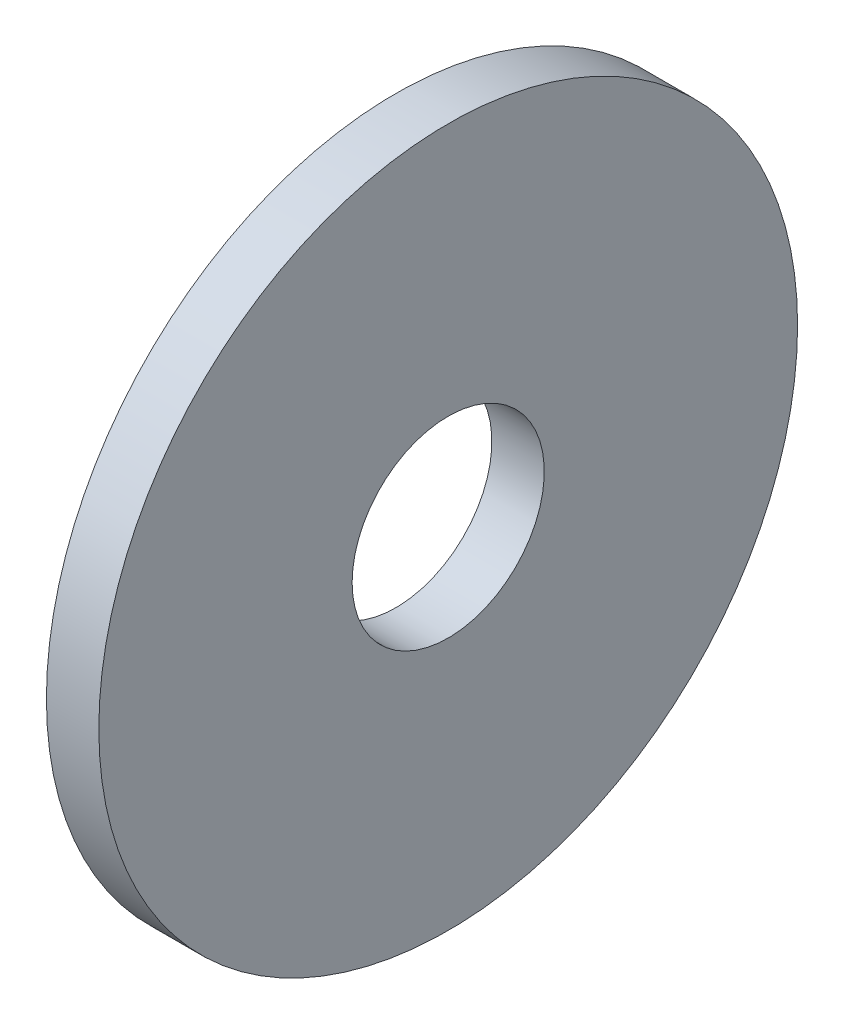
ISO-10303-21;
HEADER;
FILE_DESCRIPTION(('STEP AP214'),'2;1');
FILE_NAME('part.step','',(''),(''),'','','');
FILE_SCHEMA(('AUTOMOTIVE_DESIGN { 1 0 10303 214 1 1 1 1 }'));
ENDSEC;
DATA;
#1=APPLICATION_CONTEXT('core data for automotive mechanical design processes');
#2=APPLICATION_PROTOCOL_DEFINITION('international standard','automotive_design',2000,#1);
#3=PRODUCT_CONTEXT('',#1,'mechanical');
#4=PRODUCT('Part','Part','',(#3));
#5=PRODUCT_RELATED_PRODUCT_CATEGORY('part','',(#4));
#6=PRODUCT_DEFINITION_FORMATION('','',#4);
#7=PRODUCT_DEFINITION_CONTEXT('part definition',#1,'design');
#8=PRODUCT_DEFINITION('design','',#6,#7);
#9=PRODUCT_DEFINITION_SHAPE('','',#8);
#10=(LENGTH_UNIT() NAMED_UNIT(*) SI_UNIT(.MILLI.,.METRE.));
#11=(NAMED_UNIT(*) PLANE_ANGLE_UNIT() SI_UNIT($,.RADIAN.));
#12=(NAMED_UNIT(*) SI_UNIT($,.STERADIAN.) SOLID_ANGLE_UNIT());
#13=UNCERTAINTY_MEASURE_WITH_UNIT(LENGTH_MEASURE(1.E-05),#10,'distance_accuracy_value','');
#14=(GEOMETRIC_REPRESENTATION_CONTEXT(3) GLOBAL_UNCERTAINTY_ASSIGNED_CONTEXT((#13)) GLOBAL_UNIT_ASSIGNED_CONTEXT((#10,
#11,#12)) REPRESENTATION_CONTEXT('',''));
#15=CARTESIAN_POINT('',(0.,0.,0.));
#16=DIRECTION('',(0.,0.,1.));
#17=DIRECTION('',(1.,0.,0.));
#18=AXIS2_PLACEMENT_3D('',#15,#16,#17);
#19=CARTESIAN_POINT('',(3.,0.,0.));
#20=DIRECTION('',(-1.,0.,0.));
#21=DIRECTION('',(0.,0.,1.));
#22=AXIS2_PLACEMENT_3D('',#19,#20,#21);
#23=CYLINDRICAL_SURFACE('',#22,5.5);
#24=CARTESIAN_POINT('',(3.,0.,0.));
#25=DIRECTION('',(1.,0.,0.));
#26=DIRECTION('',(0.,0.,-1.));
#27=AXIS2_PLACEMENT_3D('',#24,#25,#26);
#28=CIRCLE('',#27,5.5);
#29=CARTESIAN_POINT('',(3.,0.,5.5));
#30=VERTEX_POINT('',#29);
#31=EDGE_CURVE('E38',#30,#30,#28,.T.);
#32=CARTESIAN_POINT('',(0.,0.,0.));
#33=DIRECTION('',(1.,0.,0.));
#34=DIRECTION('',(0.,0.,-1.));
#35=AXIS2_PLACEMENT_3D('',#32,#33,#34);
#36=CIRCLE('',#35,5.5);
#37=CARTESIAN_POINT('',(0.,0.,5.5));
#38=VERTEX_POINT('',#37);
#39=EDGE_CURVE('E44',#38,#38,#36,.T.);
#40=CARTESIAN_POINT('',(3.,0.,5.5));
#41=CARTESIAN_POINT('',(2.96875,0.,5.5));
#42=CARTESIAN_POINT('',(2.9375,0.,5.5));
#43=CARTESIAN_POINT('',(2.875,0.,5.5));
#44=CARTESIAN_POINT('',(2.84375,0.,5.5));
#45=CARTESIAN_POINT('',(2.78125,0.,5.5));
#46=CARTESIAN_POINT('',(2.75,0.,5.5));
#47=CARTESIAN_POINT('',(2.6875,0.,5.5));
#48=CARTESIAN_POINT('',(2.65625,0.,5.5));
#49=CARTESIAN_POINT('',(2.59375,0.,5.5));
#50=CARTESIAN_POINT('',(2.5625,0.,5.5));
#51=CARTESIAN_POINT('',(2.5,0.,5.5));
#52=CARTESIAN_POINT('',(2.46875,0.,5.5));
#53=CARTESIAN_POINT('',(2.40625,0.,5.5));
#54=CARTESIAN_POINT('',(2.375,0.,5.5));
#55=CARTESIAN_POINT('',(2.3125,0.,5.5));
#56=CARTESIAN_POINT('',(2.28125,0.,5.5));
#57=CARTESIAN_POINT('',(2.21875,0.,5.5));
#58=CARTESIAN_POINT('',(2.1875,0.,5.5));
#59=CARTESIAN_POINT('',(2.125,0.,5.5));
#60=CARTESIAN_POINT('',(2.09375,0.,5.5));
#61=CARTESIAN_POINT('',(2.03125,0.,5.5));
#62=CARTESIAN_POINT('',(2.,0.,5.5));
#63=CARTESIAN_POINT('',(1.9375,0.,5.5));
#64=CARTESIAN_POINT('',(1.90625,0.,5.5));
#65=CARTESIAN_POINT('',(1.84375,0.,5.5));
#66=CARTESIAN_POINT('',(1.8125,0.,5.5));
#67=CARTESIAN_POINT('',(1.75,0.,5.5));
#68=CARTESIAN_POINT('',(1.71875,0.,5.5));
#69=CARTESIAN_POINT('',(1.65625,0.,5.5));
#70=CARTESIAN_POINT('',(1.625,0.,5.5));
#71=CARTESIAN_POINT('',(1.5625,0.,5.5));
#72=CARTESIAN_POINT('',(1.53125,0.,5.5));
#73=CARTESIAN_POINT('',(1.46875,0.,5.5));
#74=CARTESIAN_POINT('',(1.4375,0.,5.5));
#75=CARTESIAN_POINT('',(1.375,0.,5.5));
#76=CARTESIAN_POINT('',(1.34375,0.,5.5));
#77=CARTESIAN_POINT('',(1.28125,0.,5.5));
#78=CARTESIAN_POINT('',(1.25,0.,5.5));
#79=CARTESIAN_POINT('',(1.1875,0.,5.5));
#80=CARTESIAN_POINT('',(1.15625,0.,5.5));
#81=CARTESIAN_POINT('',(1.09375,0.,5.5));
#82=CARTESIAN_POINT('',(1.0625,0.,5.5));
#83=CARTESIAN_POINT('',(1.,0.,5.5));
#84=CARTESIAN_POINT('',(0.96875,0.,5.5));
#85=CARTESIAN_POINT('',(0.90625,0.,5.5));
#86=CARTESIAN_POINT('',(0.875,0.,5.5));
#87=CARTESIAN_POINT('',(0.8125,0.,5.5));
#88=CARTESIAN_POINT('',(0.78125,0.,5.5));
#89=CARTESIAN_POINT('',(0.71875,0.,5.5));
#90=CARTESIAN_POINT('',(0.6875,0.,5.5));
#91=CARTESIAN_POINT('',(0.625,0.,5.5));
#92=CARTESIAN_POINT('',(0.59375,0.,5.5));
#93=CARTESIAN_POINT('',(0.53125,0.,5.5));
#94=CARTESIAN_POINT('',(0.5,0.,5.5));
#95=CARTESIAN_POINT('',(0.4375,0.,5.5));
#96=CARTESIAN_POINT('',(0.40625,0.,5.5));
#97=CARTESIAN_POINT('',(0.34375,0.,5.5));
#98=CARTESIAN_POINT('',(0.3125,0.,5.5));
#99=CARTESIAN_POINT('',(0.25,0.,5.5));
#100=CARTESIAN_POINT('',(0.21875,0.,5.5));
#101=CARTESIAN_POINT('',(0.15625,0.,5.5));
#102=CARTESIAN_POINT('',(0.125,0.,5.5));
#103=CARTESIAN_POINT('',(0.0625000000000001,0.,5.5));
#104=CARTESIAN_POINT('',(0.03125,0.,5.5));
#105=CARTESIAN_POINT('',(0.,0.,5.5));
#106=B_SPLINE_CURVE_WITH_KNOTS('',3,(#40,#41,#42,#43,#44,#45,#46,#47,#48,#49,#50,#51,#52,#53,
#54,#55,#56,#57,#58,#59,#60,#61,#62,#63,#64,#65,#66,#67,#68,#69,#70,#71,#72,#73,#74,#75,#76,#77,
#78,#79,#80,#81,#82,#83,#84,#85,#86,#87,#88,#89,#90,#91,#92,#93,#94,#95,#96,#97,#98,#99,#100,
#101,#102,#103,#104,#105),.UNSPECIFIED.,.F.,.F.,(4,2,2,2,2,2,2,2,2,2,2,2,2,2,2,2,2,2,2,2,2,2,2,
2,2,2,2,2,2,2,2,2,4),(0.,0.0937499999999997,0.1875,0.28125,0.375,0.46875,0.5625,0.65625,0.75,
0.84375,0.9375,1.03125,1.125,1.21875,1.3125,1.40625,1.5,1.59375,1.6875,1.78125,1.875,1.96875,
2.0625,2.15625,2.25,2.34375,2.4375,2.53125,2.625,2.71875,2.8125,2.90625,3.),.UNSPECIFIED.);
#107=EDGE_CURVE('BSEAM31',#30,#38,#106,.T.);
#108=ORIENTED_EDGE('',*,*,#31,.T.);
#109=ORIENTED_EDGE('',*,*,#39,.F.);
#110=ORIENTED_EDGE('',*,*,#107,.T.);
#111=ORIENTED_EDGE('',*,*,#107,.F.);
#112=EDGE_LOOP('',(#108,#110,#109,#111));
#113=FACE_BOUND('',#112,.T.);
#114=ADVANCED_FACE('F31',(#113),#23,.F.);
#115=CARTESIAN_POINT('',(3.,0.,0.));
#116=DIRECTION('',(-1.,0.,0.));
#117=DIRECTION('',(0.,0.,1.));
#118=AXIS2_PLACEMENT_3D('',#115,#116,#117);
#119=CYLINDRICAL_SURFACE('',#118,20.);
#120=CARTESIAN_POINT('',(3.,0.,0.));
#121=DIRECTION('',(1.,0.,0.));
#122=DIRECTION('',(0.,0.,-1.));
#123=AXIS2_PLACEMENT_3D('',#120,#121,#122);
#124=CIRCLE('',#123,20.);
#125=CARTESIAN_POINT('',(3.,0.,20.));
#126=VERTEX_POINT('',#125);
#127=EDGE_CURVE('E10',#126,#126,#124,.T.);
#128=CARTESIAN_POINT('',(0.,0.,0.));
#129=DIRECTION('',(1.,0.,0.));
#130=DIRECTION('',(0.,0.,-1.));
#131=AXIS2_PLACEMENT_3D('',#128,#129,#130);
#132=CIRCLE('',#131,20.);
#133=CARTESIAN_POINT('',(0.,0.,20.));
#134=VERTEX_POINT('',#133);
#135=EDGE_CURVE('E34',#134,#134,#132,.T.);
#136=CARTESIAN_POINT('',(3.,0.,20.));
#137=CARTESIAN_POINT('',(2.96875,0.,20.));
#138=CARTESIAN_POINT('',(2.9375,0.,20.));
#139=CARTESIAN_POINT('',(2.875,0.,20.));
#140=CARTESIAN_POINT('',(2.84375,0.,20.));
#141=CARTESIAN_POINT('',(2.78125,0.,20.));
#142=CARTESIAN_POINT('',(2.75,0.,20.));
#143=CARTESIAN_POINT('',(2.6875,0.,20.));
#144=CARTESIAN_POINT('',(2.65625,0.,20.));
#145=CARTESIAN_POINT('',(2.59375,0.,20.));
#146=CARTESIAN_POINT('',(2.5625,0.,20.));
#147=CARTESIAN_POINT('',(2.5,0.,20.));
#148=CARTESIAN_POINT('',(2.46875,0.,20.));
#149=CARTESIAN_POINT('',(2.40625,0.,20.));
#150=CARTESIAN_POINT('',(2.375,0.,20.));
#151=CARTESIAN_POINT('',(2.3125,0.,20.));
#152=CARTESIAN_POINT('',(2.28125,0.,20.));
#153=CARTESIAN_POINT('',(2.21875,0.,20.));
#154=CARTESIAN_POINT('',(2.1875,0.,20.));
#155=CARTESIAN_POINT('',(2.125,0.,20.));
#156=CARTESIAN_POINT('',(2.09375,0.,20.));
#157=CARTESIAN_POINT('',(2.03125,0.,20.));
#158=CARTESIAN_POINT('',(2.,0.,20.));
#159=CARTESIAN_POINT('',(1.9375,0.,20.));
#160=CARTESIAN_POINT('',(1.90625,0.,20.));
#161=CARTESIAN_POINT('',(1.84375,0.,20.));
#162=CARTESIAN_POINT('',(1.8125,0.,20.));
#163=CARTESIAN_POINT('',(1.75,0.,20.));
#164=CARTESIAN_POINT('',(1.71875,0.,20.));
#165=CARTESIAN_POINT('',(1.65625,0.,20.));
#166=CARTESIAN_POINT('',(1.625,0.,20.));
#167=CARTESIAN_POINT('',(1.5625,0.,20.));
#168=CARTESIAN_POINT('',(1.53125,0.,20.));
#169=CARTESIAN_POINT('',(1.46875,0.,20.));
#170=CARTESIAN_POINT('',(1.4375,0.,20.));
#171=CARTESIAN_POINT('',(1.375,0.,20.));
#172=CARTESIAN_POINT('',(1.34375,0.,20.));
#173=CARTESIAN_POINT('',(1.28125,0.,20.));
#174=CARTESIAN_POINT('',(1.25,0.,20.));
#175=CARTESIAN_POINT('',(1.1875,0.,20.));
#176=CARTESIAN_POINT('',(1.15625,0.,20.));
#177=CARTESIAN_POINT('',(1.09375,0.,20.));
#178=CARTESIAN_POINT('',(1.0625,0.,20.));
#179=CARTESIAN_POINT('',(1.,0.,20.));
#180=CARTESIAN_POINT('',(0.96875,0.,20.));
#181=CARTESIAN_POINT('',(0.90625,0.,20.));
#182=CARTESIAN_POINT('',(0.875,0.,20.));
#183=CARTESIAN_POINT('',(0.8125,0.,20.));
#184=CARTESIAN_POINT('',(0.78125,0.,20.));
#185=CARTESIAN_POINT('',(0.71875,0.,20.));
#186=CARTESIAN_POINT('',(0.6875,0.,20.));
#187=CARTESIAN_POINT('',(0.625,0.,20.));
#188=CARTESIAN_POINT('',(0.59375,0.,20.));
#189=CARTESIAN_POINT('',(0.53125,0.,20.));
#190=CARTESIAN_POINT('',(0.5,0.,20.));
#191=CARTESIAN_POINT('',(0.4375,0.,20.));
#192=CARTESIAN_POINT('',(0.40625,0.,20.));
#193=CARTESIAN_POINT('',(0.34375,0.,20.));
#194=CARTESIAN_POINT('',(0.3125,0.,20.));
#195=CARTESIAN_POINT('',(0.25,0.,20.));
#196=CARTESIAN_POINT('',(0.21875,0.,20.));
#197=CARTESIAN_POINT('',(0.15625,0.,20.));
#198=CARTESIAN_POINT('',(0.125,0.,20.));
#199=CARTESIAN_POINT('',(0.0625000000000001,0.,20.));
#200=CARTESIAN_POINT('',(0.03125,0.,20.));
#201=CARTESIAN_POINT('',(0.,0.,20.));
#202=B_SPLINE_CURVE_WITH_KNOTS('',3,(#136,#137,#138,#139,#140,#141,#142,#143,#144,#145,#146,
#147,#148,#149,#150,#151,#152,#153,#154,#155,#156,#157,#158,#159,#160,#161,#162,#163,#164,#165,
#166,#167,#168,#169,#170,#171,#172,#173,#174,#175,#176,#177,#178,#179,#180,#181,#182,#183,#184,
#185,#186,#187,#188,#189,#190,#191,#192,#193,#194,#195,#196,#197,#198,#199,#200,#201),
.UNSPECIFIED.,.F.,.F.,(4,2,2,2,2,2,2,2,2,2,2,2,2,2,2,2,2,2,2,2,2,2,2,2,2,2,2,2,2,2,2,2,4),(0.,
0.0937499999999997,0.1875,0.28125,0.375,0.46875,0.5625,0.65625,0.75,0.84375,0.9375,1.03125,
1.125,1.21875,1.3125,1.40625,1.5,1.59375,1.6875,1.78125,1.875,1.96875,2.0625,2.15625,2.25,
2.34375,2.4375,2.53125,2.625,2.71875,2.8125,2.90625,3.),.UNSPECIFIED.);
#203=EDGE_CURVE('BSEAM51',#126,#134,#202,.T.);
#204=ORIENTED_EDGE('',*,*,#127,.F.);
#205=ORIENTED_EDGE('',*,*,#135,.T.);
#206=ORIENTED_EDGE('',*,*,#203,.T.);
#207=ORIENTED_EDGE('',*,*,#203,.F.);
#208=EDGE_LOOP('',(#204,#206,#205,#207));
#209=FACE_BOUND('',#208,.T.);
#210=ADVANCED_FACE('F51',(#209),#119,.T.);
#211=CARTESIAN_POINT('',(3.,0.,0.));
#212=DIRECTION('',(1.,0.,0.));
#213=DIRECTION('',(0.,0.,-1.));
#214=AXIS2_PLACEMENT_3D('',#211,#212,#213);
#215=PLANE('',#214);
#216=ORIENTED_EDGE('',*,*,#31,.F.);
#217=EDGE_LOOP('',(#216));
#218=FACE_BOUND('',#217,.T.);
#219=ORIENTED_EDGE('',*,*,#127,.T.);
#220=EDGE_LOOP('',(#219));
#221=FACE_BOUND('',#220,.T.);
#222=ADVANCED_FACE('F55',(#218,#221),#215,.T.);
#223=CARTESIAN_POINT('',(0.,0.,0.));
#224=DIRECTION('',(1.,0.,0.));
#225=DIRECTION('',(0.,0.,-1.));
#226=AXIS2_PLACEMENT_3D('',#223,#224,#225);
#227=PLANE('',#226);
#228=ORIENTED_EDGE('',*,*,#39,.T.);
#229=EDGE_LOOP('',(#228));
#230=FACE_BOUND('',#229,.T.);
#231=ORIENTED_EDGE('',*,*,#135,.F.);
#232=EDGE_LOOP('',(#231));
#233=FACE_BOUND('',#232,.T.);
#234=ADVANCED_FACE('F53',(#230,#233),#227,.F.);
#235=CLOSED_SHELL('',(#114,#210,#222,#234));
#236=MANIFOLD_SOLID_BREP('B2',#235);
#237=ADVANCED_BREP_SHAPE_REPRESENTATION('',(#18,#236),#14);
#238=SHAPE_DEFINITION_REPRESENTATION(#9,#237);
ENDSEC;
END-ISO-10303-21;
